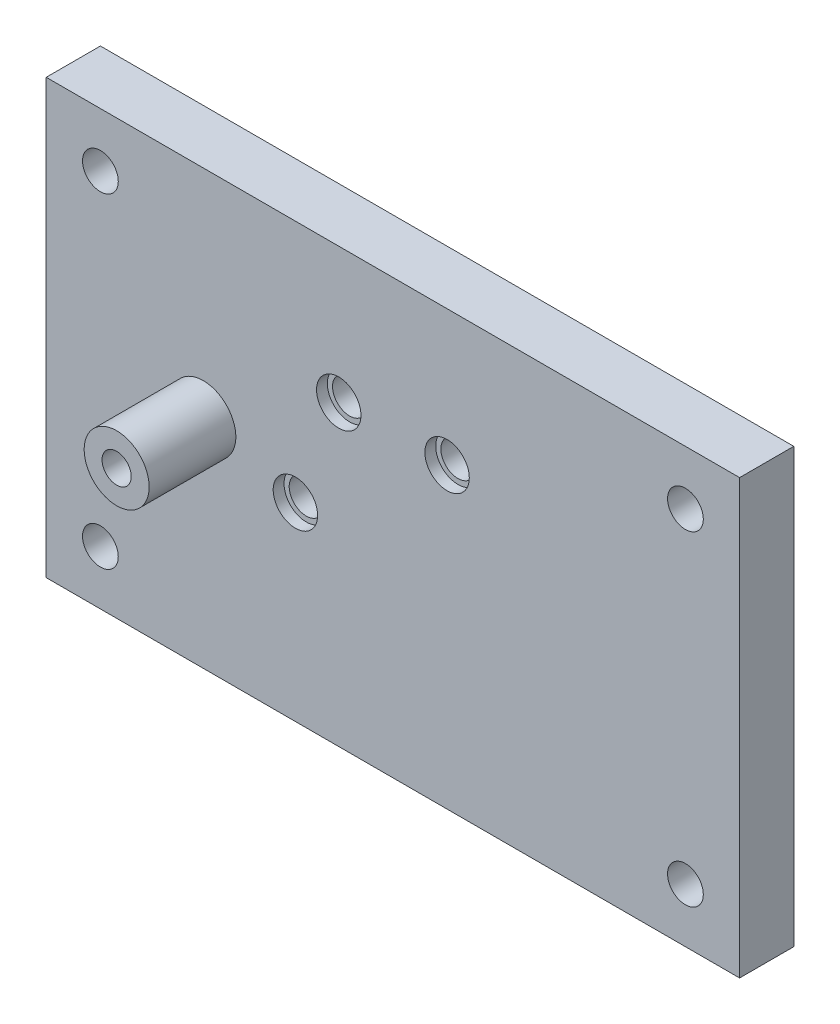
ISO-10303-21;
HEADER;
FILE_DESCRIPTION(('STEP AP214'),'2;1');
FILE_NAME('part.step','',(''),(''),'','','');
FILE_SCHEMA(('AUTOMOTIVE_DESIGN { 1 0 10303 214 1 1 1 1 }'));
ENDSEC;
DATA;
#1=APPLICATION_CONTEXT('core data for automotive mechanical design processes');
#2=APPLICATION_PROTOCOL_DEFINITION('international standard','automotive_design',2000,#1);
#3=PRODUCT_CONTEXT('',#1,'mechanical');
#4=PRODUCT('Part','Part','',(#3));
#5=PRODUCT_RELATED_PRODUCT_CATEGORY('part','',(#4));
#6=PRODUCT_DEFINITION_FORMATION('','',#4);
#7=PRODUCT_DEFINITION_CONTEXT('part definition',#1,'design');
#8=PRODUCT_DEFINITION('design','',#6,#7);
#9=PRODUCT_DEFINITION_SHAPE('','',#8);
#10=(LENGTH_UNIT() NAMED_UNIT(*) SI_UNIT(.MILLI.,.METRE.));
#11=(NAMED_UNIT(*) PLANE_ANGLE_UNIT() SI_UNIT($,.RADIAN.));
#12=(NAMED_UNIT(*) SI_UNIT($,.STERADIAN.) SOLID_ANGLE_UNIT());
#13=UNCERTAINTY_MEASURE_WITH_UNIT(LENGTH_MEASURE(1.E-05),#10,'distance_accuracy_value','');
#14=(GEOMETRIC_REPRESENTATION_CONTEXT(3) GLOBAL_UNCERTAINTY_ASSIGNED_CONTEXT((#13)) GLOBAL_UNIT_ASSIGNED_CONTEXT((#10,
#11,#12)) REPRESENTATION_CONTEXT('',''));
#15=CARTESIAN_POINT('',(0.,0.,0.));
#16=DIRECTION('',(0.,0.,1.));
#17=DIRECTION('',(1.,0.,0.));
#18=AXIS2_PLACEMENT_3D('',#15,#16,#17);
#19=CARTESIAN_POINT('',(-18.,-5.,10.));
#20=DIRECTION('',(0.,0.,-1.));
#21=DIRECTION('',(-1.,0.,0.));
#22=AXIS2_PLACEMENT_3D('',#19,#20,#21);
#23=CYLINDRICAL_SURFACE('',#22,3.15);
#24=CARTESIAN_POINT('',(-18.,-5.,0.));
#25=DIRECTION('',(0.,0.,1.));
#26=DIRECTION('',(1.,0.,0.));
#27=AXIS2_PLACEMENT_3D('',#24,#25,#26);
#28=CIRCLE('',#27,3.15);
#29=CARTESIAN_POINT('',(-14.85,-5.,0.));
#30=VERTEX_POINT('',#29);
#31=EDGE_CURVE('E120',#30,#30,#28,.T.);
#32=ORIENTED_EDGE('',*,*,#31,.F.);
#33=EDGE_LOOP('',(#32));
#34=FACE_BOUND('',#33,.T.);
#35=CARTESIAN_POINT('',(-18.,-5.,8.));
#36=DIRECTION('',(0.,0.,1.));
#37=DIRECTION('',(1.,0.,0.));
#38=AXIS2_PLACEMENT_3D('',#35,#36,#37);
#39=CIRCLE('',#38,3.15);
#40=CARTESIAN_POINT('',(-14.85,-5.,8.));
#41=VERTEX_POINT('',#40);
#42=EDGE_CURVE('E43',#41,#41,#39,.T.);
#43=ORIENTED_EDGE('',*,*,#42,.T.);
#44=EDGE_LOOP('',(#43));
#45=FACE_BOUND('',#44,.T.);
#46=ADVANCED_FACE('F39',(#34,#45),#23,.F.);
#47=CARTESIAN_POINT('',(10.,15.,10.));
#48=DIRECTION('',(0.,0.,-1.));
#49=DIRECTION('',(-1.,0.,0.));
#50=AXIS2_PLACEMENT_3D('',#47,#48,#49);
#51=CYLINDRICAL_SURFACE('',#50,3.15);
#52=CARTESIAN_POINT('',(10.,15.,0.));
#53=DIRECTION('',(0.,0.,1.));
#54=DIRECTION('',(1.,0.,0.));
#55=AXIS2_PLACEMENT_3D('',#52,#53,#54);
#56=CIRCLE('',#55,3.15);
#57=CARTESIAN_POINT('',(13.15,15.,0.));
#58=VERTEX_POINT('',#57);
#59=EDGE_CURVE('E145',#58,#58,#56,.T.);
#60=ORIENTED_EDGE('',*,*,#59,.F.);
#61=EDGE_LOOP('',(#60));
#62=FACE_BOUND('',#61,.T.);
#63=CARTESIAN_POINT('',(10.,15.,8.));
#64=DIRECTION('',(0.,0.,1.));
#65=DIRECTION('',(1.,0.,0.));
#66=AXIS2_PLACEMENT_3D('',#63,#64,#65);
#67=CIRCLE('',#66,3.15);
#68=CARTESIAN_POINT('',(13.15,15.,8.));
#69=VERTEX_POINT('',#68);
#70=EDGE_CURVE('E122',#69,#69,#67,.T.);
#71=ORIENTED_EDGE('',*,*,#70,.T.);
#72=EDGE_LOOP('',(#71));
#73=FACE_BOUND('',#72,.T.);
#74=ADVANCED_FACE('F184',(#62,#73),#51,.F.);
#75=CARTESIAN_POINT('',(-10.,15.,10.));
#76=DIRECTION('',(0.,0.,-1.));
#77=DIRECTION('',(-1.,0.,0.));
#78=AXIS2_PLACEMENT_3D('',#75,#76,#77);
#79=CYLINDRICAL_SURFACE('',#78,3.15);
#80=CARTESIAN_POINT('',(-10.,15.,0.));
#81=DIRECTION('',(0.,0.,1.));
#82=DIRECTION('',(1.,0.,0.));
#83=AXIS2_PLACEMENT_3D('',#80,#81,#82);
#84=CIRCLE('',#83,3.15);
#85=CARTESIAN_POINT('',(-6.85,15.,0.));
#86=VERTEX_POINT('',#85);
#87=EDGE_CURVE('E148',#86,#86,#84,.T.);
#88=ORIENTED_EDGE('',*,*,#87,.F.);
#89=EDGE_LOOP('',(#88));
#90=FACE_BOUND('',#89,.T.);
#91=CARTESIAN_POINT('',(-10.,15.,8.));
#92=DIRECTION('',(0.,0.,1.));
#93=DIRECTION('',(1.,0.,0.));
#94=AXIS2_PLACEMENT_3D('',#91,#92,#93);
#95=CIRCLE('',#94,3.15);
#96=CARTESIAN_POINT('',(-6.85,15.,8.));
#97=VERTEX_POINT('',#96);
#98=EDGE_CURVE('E118',#97,#97,#95,.T.);
#99=ORIENTED_EDGE('',*,*,#98,.T.);
#100=EDGE_LOOP('',(#99));
#101=FACE_BOUND('',#100,.T.);
#102=ADVANCED_FACE('F192',(#90,#101),#79,.F.);
#103=CARTESIAN_POINT('',(-64.,-40.,10.));
#104=DIRECTION('',(1.,0.,0.));
#105=DIRECTION('',(0.,0.,-1.));
#106=AXIS2_PLACEMENT_3D('',#103,#104,#105);
#107=PLANE('',#106);
#108=DIRECTION('',(0.,-1.,0.));
#109=VECTOR('',#108,1.);
#110=CARTESIAN_POINT('',(-64.,-40.,0.));
#111=LINE('',#110,#109);
#112=CARTESIAN_POINT('',(-64.,40.,0.));
#113=VERTEX_POINT('',#112);
#114=CARTESIAN_POINT('',(-64.,-40.,0.));
#115=VERTEX_POINT('',#114);
#116=EDGE_CURVE('E108',#113,#115,#111,.T.);
#117=ORIENTED_EDGE('',*,*,#116,.T.);
#118=DIRECTION('',(0.,0.,-1.));
#119=VECTOR('',#118,1.);
#120=CARTESIAN_POINT('',(-64.,-40.,10.));
#121=LINE('',#120,#119);
#122=CARTESIAN_POINT('',(-64.,-40.,10.));
#123=VERTEX_POINT('',#122);
#124=EDGE_CURVE('E49',#123,#115,#121,.T.);
#125=ORIENTED_EDGE('',*,*,#124,.F.);
#126=DIRECTION('',(0.,-1.,0.));
#127=VECTOR('',#126,1.);
#128=CARTESIAN_POINT('',(-64.,-40.,10.));
#129=LINE('',#128,#127);
#130=CARTESIAN_POINT('',(-64.,40.,10.));
#131=VERTEX_POINT('',#130);
#132=EDGE_CURVE('E94',#131,#123,#129,.T.);
#133=ORIENTED_EDGE('',*,*,#132,.F.);
#134=DIRECTION('',(0.,0.,-1.));
#135=VECTOR('',#134,1.);
#136=CARTESIAN_POINT('',(-64.,40.,10.));
#137=LINE('',#136,#135);
#138=EDGE_CURVE('E104',#131,#113,#137,.T.);
#139=ORIENTED_EDGE('',*,*,#138,.T.);
#140=EDGE_LOOP('',(#117,#125,#133,#139));
#141=FACE_BOUND('',#140,.T.);
#142=ADVANCED_FACE('F41',(#141),#107,.F.);
#143=CARTESIAN_POINT('',(-64.,-40.,10.));
#144=DIRECTION('',(0.,1.,0.));
#145=DIRECTION('',(0.,0.,1.));
#146=AXIS2_PLACEMENT_3D('',#143,#144,#145);
#147=PLANE('',#146);
#148=DIRECTION('',(1.,0.,0.));
#149=VECTOR('',#148,1.);
#150=CARTESIAN_POINT('',(-64.,-40.,0.));
#151=LINE('',#150,#149);
#152=CARTESIAN_POINT('',(64.,-40.,0.));
#153=VERTEX_POINT('',#152);
#154=EDGE_CURVE('E99',#115,#153,#151,.T.);
#155=ORIENTED_EDGE('',*,*,#154,.T.);
#156=DIRECTION('',(0.,0.,-1.));
#157=VECTOR('',#156,1.);
#158=CARTESIAN_POINT('',(64.,-40.,10.));
#159=LINE('',#158,#157);
#160=CARTESIAN_POINT('',(64.,-40.,10.));
#161=VERTEX_POINT('',#160);
#162=EDGE_CURVE('E97',#161,#153,#159,.T.);
#163=ORIENTED_EDGE('',*,*,#162,.F.);
#164=DIRECTION('',(1.,0.,0.));
#165=VECTOR('',#164,1.);
#166=CARTESIAN_POINT('',(-64.,-40.,10.));
#167=LINE('',#166,#165);
#168=EDGE_CURVE('E89',#123,#161,#167,.T.);
#169=ORIENTED_EDGE('',*,*,#168,.F.);
#170=ORIENTED_EDGE('',*,*,#124,.T.);
#171=EDGE_LOOP('',(#155,#163,#169,#170));
#172=FACE_BOUND('',#171,.T.);
#173=ADVANCED_FACE('F98',(#172),#147,.F.);
#174=CARTESIAN_POINT('',(64.,-40.,10.));
#175=DIRECTION('',(-1.,0.,0.));
#176=DIRECTION('',(0.,0.,1.));
#177=AXIS2_PLACEMENT_3D('',#174,#175,#176);
#178=PLANE('',#177);
#179=DIRECTION('',(0.,1.,0.));
#180=VECTOR('',#179,1.);
#181=CARTESIAN_POINT('',(64.,-40.,0.));
#182=LINE('',#181,#180);
#183=CARTESIAN_POINT('',(64.,40.,0.));
#184=VERTEX_POINT('',#183);
#185=EDGE_CURVE('E75',#153,#184,#182,.T.);
#186=ORIENTED_EDGE('',*,*,#185,.T.);
#187=DIRECTION('',(0.,0.,-1.));
#188=VECTOR('',#187,1.);
#189=CARTESIAN_POINT('',(64.,40.,10.));
#190=LINE('',#189,#188);
#191=CARTESIAN_POINT('',(64.,40.,10.));
#192=VERTEX_POINT('',#191);
#193=EDGE_CURVE('E100',#192,#184,#190,.T.);
#194=ORIENTED_EDGE('',*,*,#193,.F.);
#195=DIRECTION('',(0.,1.,0.));
#196=VECTOR('',#195,1.);
#197=CARTESIAN_POINT('',(64.,-40.,10.));
#198=LINE('',#197,#196);
#199=EDGE_CURVE('E92',#161,#192,#198,.T.);
#200=ORIENTED_EDGE('',*,*,#199,.F.);
#201=ORIENTED_EDGE('',*,*,#162,.T.);
#202=EDGE_LOOP('',(#186,#194,#200,#201));
#203=FACE_BOUND('',#202,.T.);
#204=ADVANCED_FACE('F102',(#203),#178,.F.);
#205=CARTESIAN_POINT('',(-64.,40.,10.));
#206=DIRECTION('',(0.,-1.,0.));
#207=DIRECTION('',(0.,0.,-1.));
#208=AXIS2_PLACEMENT_3D('',#205,#206,#207);
#209=PLANE('',#208);
#210=DIRECTION('',(-1.,0.,0.));
#211=VECTOR('',#210,1.);
#212=CARTESIAN_POINT('',(-64.,40.,0.));
#213=LINE('',#212,#211);
#214=EDGE_CURVE('E81',#184,#113,#213,.T.);
#215=ORIENTED_EDGE('',*,*,#214,.T.);
#216=ORIENTED_EDGE('',*,*,#138,.F.);
#217=DIRECTION('',(-1.,0.,0.));
#218=VECTOR('',#217,1.);
#219=CARTESIAN_POINT('',(-64.,40.,10.));
#220=LINE('',#219,#218);
#221=EDGE_CURVE('E58',#192,#131,#220,.T.);
#222=ORIENTED_EDGE('',*,*,#221,.F.);
#223=ORIENTED_EDGE('',*,*,#193,.T.);
#224=EDGE_LOOP('',(#215,#216,#222,#223));
#225=FACE_BOUND('',#224,.T.);
#226=ADVANCED_FACE('F170',(#225),#209,.F.);
#227=CARTESIAN_POINT('',(0.,0.,10.));
#228=DIRECTION('',(0.,0.,-1.));
#229=DIRECTION('',(-1.,0.,0.));
#230=AXIS2_PLACEMENT_3D('',#227,#228,#229);
#231=PLANE('',#230);
#232=CARTESIAN_POINT('',(54.,30.,10.));
#233=DIRECTION('',(0.,0.,1.));
#234=DIRECTION('',(1.,0.,0.));
#235=AXIS2_PLACEMENT_3D('',#232,#233,#234);
#236=CIRCLE('',#235,3.3);
#237=CARTESIAN_POINT('',(57.3,30.,10.));
#238=VERTEX_POINT('',#237);
#239=EDGE_CURVE('E367',#238,#238,#236,.T.);
#240=ORIENTED_EDGE('',*,*,#239,.F.);
#241=EDGE_LOOP('',(#240));
#242=FACE_BOUND('',#241,.T.);
#243=CARTESIAN_POINT('',(54.,-30.,10.));
#244=DIRECTION('',(0.,0.,1.));
#245=DIRECTION('',(1.,0.,0.));
#246=AXIS2_PLACEMENT_3D('',#243,#244,#245);
#247=CIRCLE('',#246,3.3);
#248=CARTESIAN_POINT('',(57.3,-30.,10.));
#249=VERTEX_POINT('',#248);
#250=EDGE_CURVE('E375',#249,#249,#247,.T.);
#251=ORIENTED_EDGE('',*,*,#250,.F.);
#252=EDGE_LOOP('',(#251));
#253=FACE_BOUND('',#252,.T.);
#254=CARTESIAN_POINT('',(-54.,30.,10.));
#255=DIRECTION('',(0.,0.,1.));
#256=DIRECTION('',(1.,0.,0.));
#257=AXIS2_PLACEMENT_3D('',#254,#255,#256);
#258=CIRCLE('',#257,3.3);
#259=CARTESIAN_POINT('',(-50.7,30.,10.));
#260=VERTEX_POINT('',#259);
#261=EDGE_CURVE('E381',#260,#260,#258,.T.);
#262=ORIENTED_EDGE('',*,*,#261,.F.);
#263=EDGE_LOOP('',(#262));
#264=FACE_BOUND('',#263,.T.);
#265=CARTESIAN_POINT('',(-54.,-30.,10.));
#266=DIRECTION('',(0.,0.,1.));
#267=DIRECTION('',(1.,0.,0.));
#268=AXIS2_PLACEMENT_3D('',#265,#266,#267);
#269=CIRCLE('',#268,3.3);
#270=CARTESIAN_POINT('',(-50.7,-30.,10.));
#271=VERTEX_POINT('',#270);
#272=EDGE_CURVE('E387',#271,#271,#269,.T.);
#273=ORIENTED_EDGE('',*,*,#272,.F.);
#274=EDGE_LOOP('',(#273));
#275=FACE_BOUND('',#274,.T.);
#276=CARTESIAN_POINT('',(-18.,-5.,10.));
#277=DIRECTION('',(0.,0.,1.));
#278=DIRECTION('',(1.,0.,0.));
#279=AXIS2_PLACEMENT_3D('',#276,#277,#278);
#280=CIRCLE('',#279,4.1);
#281=CARTESIAN_POINT('',(-13.9,-5.,10.));
#282=VERTEX_POINT('',#281);
#283=EDGE_CURVE('E391',#282,#282,#280,.T.);
#284=ORIENTED_EDGE('',*,*,#283,.F.);
#285=EDGE_LOOP('',(#284));
#286=FACE_BOUND('',#285,.T.);
#287=CARTESIAN_POINT('',(10.,15.,10.));
#288=DIRECTION('',(0.,0.,1.));
#289=DIRECTION('',(1.,0.,0.));
#290=AXIS2_PLACEMENT_3D('',#287,#288,#289);
#291=CIRCLE('',#290,4.1);
#292=CARTESIAN_POINT('',(14.1,15.,10.));
#293=VERTEX_POINT('',#292);
#294=EDGE_CURVE('E125',#293,#293,#291,.T.);
#295=ORIENTED_EDGE('',*,*,#294,.F.);
#296=EDGE_LOOP('',(#295));
#297=FACE_BOUND('',#296,.T.);
#298=CARTESIAN_POINT('',(-10.,15.,10.));
#299=DIRECTION('',(0.,0.,1.));
#300=DIRECTION('',(1.,0.,0.));
#301=AXIS2_PLACEMENT_3D('',#298,#299,#300);
#302=CIRCLE('',#301,4.1);
#303=CARTESIAN_POINT('',(-5.9,15.,10.));
#304=VERTEX_POINT('',#303);
#305=EDGE_CURVE('E121',#304,#304,#302,.T.);
#306=ORIENTED_EDGE('',*,*,#305,.F.);
#307=EDGE_LOOP('',(#306));
#308=FACE_BOUND('',#307,.T.);
#309=CARTESIAN_POINT('',(-35.,0.,10.));
#310=DIRECTION('',(0.,0.,-1.));
#311=DIRECTION('',(-1.,0.,0.));
#312=AXIS2_PLACEMENT_3D('',#309,#310,#311);
#313=CIRCLE('',#312,6.);
#314=CARTESIAN_POINT('',(-41.,0.,10.));
#315=VERTEX_POINT('',#314);
#316=EDGE_CURVE('E11',#315,#315,#313,.F.);
#317=ORIENTED_EDGE('',*,*,#316,.F.);
#318=EDGE_LOOP('',(#317));
#319=FACE_BOUND('',#318,.T.);
#320=ORIENTED_EDGE('',*,*,#132,.T.);
#321=ORIENTED_EDGE('',*,*,#168,.T.);
#322=ORIENTED_EDGE('',*,*,#199,.T.);
#323=ORIENTED_EDGE('',*,*,#221,.T.);
#324=EDGE_LOOP('',(#320,#321,#322,#323));
#325=FACE_BOUND('',#324,.T.);
#326=ADVANCED_FACE('F90',(#242,#253,#264,#275,#286,#297,#308,#319,#325),#231,.F.);
#327=CARTESIAN_POINT('',(0.,0.,0.));
#328=DIRECTION('',(0.,0.,-1.));
#329=DIRECTION('',(-1.,0.,0.));
#330=AXIS2_PLACEMENT_3D('',#327,#328,#329);
#331=PLANE('',#330);
#332=CARTESIAN_POINT('',(54.,30.,0.));
#333=DIRECTION('',(0.,0.,1.));
#334=DIRECTION('',(1.,0.,0.));
#335=AXIS2_PLACEMENT_3D('',#332,#333,#334);
#336=CIRCLE('',#335,3.3);
#337=CARTESIAN_POINT('',(57.3,30.,0.));
#338=VERTEX_POINT('',#337);
#339=EDGE_CURVE('E370',#338,#338,#336,.T.);
#340=ORIENTED_EDGE('',*,*,#339,.T.);
#341=EDGE_LOOP('',(#340));
#342=FACE_BOUND('',#341,.T.);
#343=CARTESIAN_POINT('',(54.,-30.,0.));
#344=DIRECTION('',(0.,0.,1.));
#345=DIRECTION('',(1.,0.,0.));
#346=AXIS2_PLACEMENT_3D('',#343,#344,#345);
#347=CIRCLE('',#346,3.3);
#348=CARTESIAN_POINT('',(57.3,-30.,0.));
#349=VERTEX_POINT('',#348);
#350=EDGE_CURVE('E372',#349,#349,#347,.T.);
#351=ORIENTED_EDGE('',*,*,#350,.T.);
#352=EDGE_LOOP('',(#351));
#353=FACE_BOUND('',#352,.T.);
#354=CARTESIAN_POINT('',(-54.,30.,0.));
#355=DIRECTION('',(0.,0.,1.));
#356=DIRECTION('',(1.,0.,0.));
#357=AXIS2_PLACEMENT_3D('',#354,#355,#356);
#358=CIRCLE('',#357,3.3);
#359=CARTESIAN_POINT('',(-50.7,30.,0.));
#360=VERTEX_POINT('',#359);
#361=EDGE_CURVE('E378',#360,#360,#358,.T.);
#362=ORIENTED_EDGE('',*,*,#361,.T.);
#363=EDGE_LOOP('',(#362));
#364=FACE_BOUND('',#363,.T.);
#365=CARTESIAN_POINT('',(-54.,-30.,0.));
#366=DIRECTION('',(0.,0.,1.));
#367=DIRECTION('',(1.,0.,0.));
#368=AXIS2_PLACEMENT_3D('',#365,#366,#367);
#369=CIRCLE('',#368,3.3);
#370=CARTESIAN_POINT('',(-50.7,-30.,0.));
#371=VERTEX_POINT('',#370);
#372=EDGE_CURVE('E384',#371,#371,#369,.T.);
#373=ORIENTED_EDGE('',*,*,#372,.T.);
#374=EDGE_LOOP('',(#373));
#375=FACE_BOUND('',#374,.T.);
#376=ORIENTED_EDGE('',*,*,#31,.T.);
#377=EDGE_LOOP('',(#376));
#378=FACE_BOUND('',#377,.T.);
#379=ORIENTED_EDGE('',*,*,#59,.T.);
#380=EDGE_LOOP('',(#379));
#381=FACE_BOUND('',#380,.T.);
#382=ORIENTED_EDGE('',*,*,#87,.T.);
#383=EDGE_LOOP('',(#382));
#384=FACE_BOUND('',#383,.T.);
#385=CARTESIAN_POINT('',(-35.,0.,0.));
#386=DIRECTION('',(0.,0.,1.));
#387=DIRECTION('',(1.,0.,0.));
#388=AXIS2_PLACEMENT_3D('',#385,#386,#387);
#389=CIRCLE('',#388,2.7);
#390=CARTESIAN_POINT('',(-37.7,0.,0.));
#391=VERTEX_POINT('',#390);
#392=EDGE_CURVE('E151',#391,#391,#389,.T.);
#393=ORIENTED_EDGE('',*,*,#392,.T.);
#394=EDGE_LOOP('',(#393));
#395=FACE_BOUND('',#394,.T.);
#396=ORIENTED_EDGE('',*,*,#116,.F.);
#397=ORIENTED_EDGE('',*,*,#214,.F.);
#398=ORIENTED_EDGE('',*,*,#185,.F.);
#399=ORIENTED_EDGE('',*,*,#154,.F.);
#400=EDGE_LOOP('',(#396,#397,#398,#399));
#401=FACE_BOUND('',#400,.T.);
#402=ADVANCED_FACE('F165',(#342,#353,#364,#375,#378,#381,#384,#395,#401),#331,.T.);
#403=CARTESIAN_POINT('',(-35.,0.,26.));
#404=DIRECTION('',(0.,0.,-1.));
#405=DIRECTION('',(-1.,0.,0.));
#406=AXIS2_PLACEMENT_3D('',#403,#404,#405);
#407=CYLINDRICAL_SURFACE('',#406,6.);
#408=CARTESIAN_POINT('',(-35.,0.,26.));
#409=DIRECTION('',(0.,0.,1.));
#410=DIRECTION('',(1.,0.,0.));
#411=AXIS2_PLACEMENT_3D('',#408,#409,#410);
#412=CIRCLE('',#411,6.);
#413=CARTESIAN_POINT('',(-29.,0.,26.));
#414=VERTEX_POINT('',#413);
#415=EDGE_CURVE('E111',#414,#414,#412,.T.);
#416=ORIENTED_EDGE('',*,*,#415,.F.);
#417=EDGE_LOOP('',(#416));
#418=FACE_BOUND('',#417,.T.);
#419=ORIENTED_EDGE('',*,*,#316,.T.);
#420=EDGE_LOOP('',(#419));
#421=FACE_BOUND('',#420,.T.);
#422=ADVANCED_FACE('F162',(#418,#421),#407,.T.);
#423=CARTESIAN_POINT('',(-35.,0.,26.));
#424=DIRECTION('',(0.,0.,1.));
#425=DIRECTION('',(1.,0.,0.));
#426=AXIS2_PLACEMENT_3D('',#423,#424,#425);
#427=PLANE('',#426);
#428=CARTESIAN_POINT('',(-35.,0.,26.));
#429=DIRECTION('',(0.,0.,1.));
#430=DIRECTION('',(1.,0.,0.));
#431=AXIS2_PLACEMENT_3D('',#428,#429,#430);
#432=CIRCLE('',#431,2.7);
#433=CARTESIAN_POINT('',(-37.7,0.,26.));
#434=VERTEX_POINT('',#433);
#435=EDGE_CURVE('E152',#434,#434,#432,.T.);
#436=ORIENTED_EDGE('',*,*,#435,.F.);
#437=EDGE_LOOP('',(#436));
#438=FACE_BOUND('',#437,.T.);
#439=ORIENTED_EDGE('',*,*,#415,.T.);
#440=EDGE_LOOP('',(#439));
#441=FACE_BOUND('',#440,.T.);
#442=ADVANCED_FACE('F160',(#438,#441),#427,.T.);
#443=CARTESIAN_POINT('',(-35.,0.,26.));
#444=DIRECTION('',(0.,0.,-1.));
#445=DIRECTION('',(-1.,0.,0.));
#446=AXIS2_PLACEMENT_3D('',#443,#444,#445);
#447=CYLINDRICAL_SURFACE('',#446,2.7);
#448=CARTESIAN_POINT('',(-37.7,0.,26.));
#449=CARTESIAN_POINT('',(-37.7,0.,25.7291666666667));
#450=CARTESIAN_POINT('',(-37.7,0.,25.4583333333333));
#451=CARTESIAN_POINT('',(-37.7,0.,24.9166666666667));
#452=CARTESIAN_POINT('',(-37.7,0.,24.6458333333333));
#453=CARTESIAN_POINT('',(-37.7,0.,24.1041666666667));
#454=CARTESIAN_POINT('',(-37.7,0.,23.8333333333333));
#455=CARTESIAN_POINT('',(-37.7,0.,23.2916666666667));
#456=CARTESIAN_POINT('',(-37.7,0.,23.0208333333333));
#457=CARTESIAN_POINT('',(-37.7,0.,22.4791666666667));
#458=CARTESIAN_POINT('',(-37.7,0.,22.2083333333333));
#459=CARTESIAN_POINT('',(-37.7,0.,21.6666666666667));
#460=CARTESIAN_POINT('',(-37.7,0.,21.3958333333333));
#461=CARTESIAN_POINT('',(-37.7,0.,20.8541666666667));
#462=CARTESIAN_POINT('',(-37.7,0.,20.5833333333333));
#463=CARTESIAN_POINT('',(-37.7,0.,20.0416666666667));
#464=CARTESIAN_POINT('',(-37.7,0.,19.7708333333333));
#465=CARTESIAN_POINT('',(-37.7,0.,19.2291666666667));
#466=CARTESIAN_POINT('',(-37.7,0.,18.9583333333333));
#467=CARTESIAN_POINT('',(-37.7,0.,18.4166666666667));
#468=CARTESIAN_POINT('',(-37.7,0.,18.1458333333333));
#469=CARTESIAN_POINT('',(-37.7,0.,17.6041666666667));
#470=CARTESIAN_POINT('',(-37.7,0.,17.3333333333333));
#471=CARTESIAN_POINT('',(-37.7,0.,16.7916666666667));
#472=CARTESIAN_POINT('',(-37.7,0.,16.5208333333333));
#473=CARTESIAN_POINT('',(-37.7,0.,15.9791666666667));
#474=CARTESIAN_POINT('',(-37.7,0.,15.7083333333333));
#475=CARTESIAN_POINT('',(-37.7,0.,15.1666666666667));
#476=CARTESIAN_POINT('',(-37.7,0.,14.8958333333333));
#477=CARTESIAN_POINT('',(-37.7,0.,14.3541666666667));
#478=CARTESIAN_POINT('',(-37.7,0.,14.0833333333333));
#479=CARTESIAN_POINT('',(-37.7,0.,13.5416666666667));
#480=CARTESIAN_POINT('',(-37.7,0.,13.2708333333333));
#481=CARTESIAN_POINT('',(-37.7,0.,12.7291666666667));
#482=CARTESIAN_POINT('',(-37.7,0.,12.4583333333333));
#483=CARTESIAN_POINT('',(-37.7,0.,11.9166666666667));
#484=CARTESIAN_POINT('',(-37.7,0.,11.6458333333333));
#485=CARTESIAN_POINT('',(-37.7,0.,11.1041666666667));
#486=CARTESIAN_POINT('',(-37.7,0.,10.8333333333333));
#487=CARTESIAN_POINT('',(-37.7,0.,10.2916666666667));
#488=CARTESIAN_POINT('',(-37.7,0.,10.0208333333333));
#489=CARTESIAN_POINT('',(-37.7,0.,9.47916666666667));
#490=CARTESIAN_POINT('',(-37.7,0.,9.20833333333333));
#491=CARTESIAN_POINT('',(-37.7,0.,8.66666666666667));
#492=CARTESIAN_POINT('',(-37.7,0.,8.39583333333333));
#493=CARTESIAN_POINT('',(-37.7,0.,7.85416666666667));
#494=CARTESIAN_POINT('',(-37.7,0.,7.58333333333333));
#495=CARTESIAN_POINT('',(-37.7,0.,7.04166666666667));
#496=CARTESIAN_POINT('',(-37.7,0.,6.77083333333333));
#497=CARTESIAN_POINT('',(-37.7,0.,6.22916666666667));
#498=CARTESIAN_POINT('',(-37.7,0.,5.95833333333333));
#499=CARTESIAN_POINT('',(-37.7,0.,5.41666666666667));
#500=CARTESIAN_POINT('',(-37.7,0.,5.14583333333333));
#501=CARTESIAN_POINT('',(-37.7,0.,4.60416666666667));
#502=CARTESIAN_POINT('',(-37.7,0.,4.33333333333333));
#503=CARTESIAN_POINT('',(-37.7,0.,3.79166666666667));
#504=CARTESIAN_POINT('',(-37.7,0.,3.52083333333333));
#505=CARTESIAN_POINT('',(-37.7,0.,2.97916666666667));
#506=CARTESIAN_POINT('',(-37.7,0.,2.70833333333333));
#507=CARTESIAN_POINT('',(-37.7,0.,2.16666666666667));
#508=CARTESIAN_POINT('',(-37.7,0.,1.89583333333333));
#509=CARTESIAN_POINT('',(-37.7,0.,1.35416666666667));
#510=CARTESIAN_POINT('',(-37.7,0.,1.08333333333333));
#511=CARTESIAN_POINT('',(-37.7,0.,0.541666666666667));
#512=CARTESIAN_POINT('',(-37.7,0.,0.270833333333334));
#513=CARTESIAN_POINT('',(-37.7,0.,0.));
#514=B_SPLINE_CURVE_WITH_KNOTS('',3,(#448,#449,#450,#451,#452,#453,#454,#455,#456,#457,#458,
#459,#460,#461,#462,#463,#464,#465,#466,#467,#468,#469,#470,#471,#472,#473,#474,#475,#476,#477,
#478,#479,#480,#481,#482,#483,#484,#485,#486,#487,#488,#489,#490,#491,#492,#493,#494,#495,#496,
#497,#498,#499,#500,#501,#502,#503,#504,#505,#506,#507,#508,#509,#510,#511,#512,#513),
.UNSPECIFIED.,.F.,.F.,(4,2,2,2,2,2,2,2,2,2,2,2,2,2,2,2,2,2,2,2,2,2,2,2,2,2,2,2,2,2,2,2,4),(0.,
0.812500000000001,1.625,2.4375,3.25,4.0625,4.875,5.6875,6.5,7.3125,8.125,8.9375,9.75,10.5625,
11.375,12.1875,13.,13.8125,14.625,15.4375,16.25,17.0625,17.875,18.6875,19.5,20.3125,21.125,
21.9375,22.75,23.5625,24.375,25.1875,26.),.UNSPECIFIED.);
#515=EDGE_CURVE('BSEAM204',#434,#391,#514,.T.);
#516=ORIENTED_EDGE('',*,*,#435,.T.);
#517=ORIENTED_EDGE('',*,*,#392,.F.);
#518=ORIENTED_EDGE('',*,*,#515,.T.);
#519=ORIENTED_EDGE('',*,*,#515,.F.);
#520=EDGE_LOOP('',(#516,#518,#517,#519));
#521=FACE_BOUND('',#520,.T.);
#522=ADVANCED_FACE('F204',(#521),#447,.F.);
#523=CARTESIAN_POINT('',(-10.,15.,10.));
#524=DIRECTION('',(0.,0.,-1.));
#525=DIRECTION('',(-1.,0.,0.));
#526=AXIS2_PLACEMENT_3D('',#523,#524,#525);
#527=CYLINDRICAL_SURFACE('',#526,4.1);
#528=ORIENTED_EDGE('',*,*,#305,.T.);
#529=EDGE_LOOP('',(#528));
#530=FACE_BOUND('',#529,.T.);
#531=CARTESIAN_POINT('',(-10.,15.,8.));
#532=DIRECTION('',(0.,0.,1.));
#533=DIRECTION('',(1.,0.,0.));
#534=AXIS2_PLACEMENT_3D('',#531,#532,#533);
#535=CIRCLE('',#534,4.1);
#536=CARTESIAN_POINT('',(-5.9,15.,8.));
#537=VERTEX_POINT('',#536);
#538=EDGE_CURVE('E124',#537,#537,#535,.T.);
#539=ORIENTED_EDGE('',*,*,#538,.F.);
#540=EDGE_LOOP('',(#539));
#541=FACE_BOUND('',#540,.T.);
#542=ADVANCED_FACE('F198',(#530,#541),#527,.F.);
#543=CARTESIAN_POINT('',(-10.,15.,8.));
#544=DIRECTION('',(0.,0.,1.));
#545=DIRECTION('',(1.,0.,0.));
#546=AXIS2_PLACEMENT_3D('',#543,#544,#545);
#547=PLANE('',#546);
#548=ORIENTED_EDGE('',*,*,#98,.F.);
#549=EDGE_LOOP('',(#548));
#550=FACE_BOUND('',#549,.T.);
#551=ORIENTED_EDGE('',*,*,#538,.T.);
#552=EDGE_LOOP('',(#551));
#553=FACE_BOUND('',#552,.T.);
#554=ADVANCED_FACE('F268',(#550,#553),#547,.T.);
#555=CARTESIAN_POINT('',(10.,15.,10.));
#556=DIRECTION('',(0.,0.,-1.));
#557=DIRECTION('',(-1.,0.,0.));
#558=AXIS2_PLACEMENT_3D('',#555,#556,#557);
#559=CYLINDRICAL_SURFACE('',#558,4.1);
#560=ORIENTED_EDGE('',*,*,#294,.T.);
#561=EDGE_LOOP('',(#560));
#562=FACE_BOUND('',#561,.T.);
#563=CARTESIAN_POINT('',(10.,15.,8.));
#564=DIRECTION('',(0.,0.,1.));
#565=DIRECTION('',(1.,0.,0.));
#566=AXIS2_PLACEMENT_3D('',#563,#564,#565);
#567=CIRCLE('',#566,4.1);
#568=CARTESIAN_POINT('',(14.1,15.,8.));
#569=VERTEX_POINT('',#568);
#570=EDGE_CURVE('E131',#569,#569,#567,.T.);
#571=ORIENTED_EDGE('',*,*,#570,.F.);
#572=EDGE_LOOP('',(#571));
#573=FACE_BOUND('',#572,.T.);
#574=ADVANCED_FACE('F277',(#562,#573),#559,.F.);
#575=CARTESIAN_POINT('',(10.,15.,8.));
#576=DIRECTION('',(0.,0.,1.));
#577=DIRECTION('',(1.,0.,0.));
#578=AXIS2_PLACEMENT_3D('',#575,#576,#577);
#579=PLANE('',#578);
#580=ORIENTED_EDGE('',*,*,#70,.F.);
#581=EDGE_LOOP('',(#580));
#582=FACE_BOUND('',#581,.T.);
#583=ORIENTED_EDGE('',*,*,#570,.T.);
#584=EDGE_LOOP('',(#583));
#585=FACE_BOUND('',#584,.T.);
#586=ADVANCED_FACE('F291',(#582,#585),#579,.T.);
#587=CARTESIAN_POINT('',(-18.,-5.,10.));
#588=DIRECTION('',(0.,0.,-1.));
#589=DIRECTION('',(-1.,0.,0.));
#590=AXIS2_PLACEMENT_3D('',#587,#588,#589);
#591=CYLINDRICAL_SURFACE('',#590,4.1);
#592=ORIENTED_EDGE('',*,*,#283,.T.);
#593=EDGE_LOOP('',(#592));
#594=FACE_BOUND('',#593,.T.);
#595=CARTESIAN_POINT('',(-18.,-5.,8.));
#596=DIRECTION('',(0.,0.,1.));
#597=DIRECTION('',(1.,0.,0.));
#598=AXIS2_PLACEMENT_3D('',#595,#596,#597);
#599=CIRCLE('',#598,4.1);
#600=CARTESIAN_POINT('',(-13.9,-5.,8.));
#601=VERTEX_POINT('',#600);
#602=EDGE_CURVE('E138',#601,#601,#599,.T.);
#603=ORIENTED_EDGE('',*,*,#602,.F.);
#604=EDGE_LOOP('',(#603));
#605=FACE_BOUND('',#604,.T.);
#606=ADVANCED_FACE('F299',(#594,#605),#591,.F.);
#607=CARTESIAN_POINT('',(-18.,-5.,8.));
#608=DIRECTION('',(0.,0.,1.));
#609=DIRECTION('',(1.,0.,0.));
#610=AXIS2_PLACEMENT_3D('',#607,#608,#609);
#611=PLANE('',#610);
#612=ORIENTED_EDGE('',*,*,#42,.F.);
#613=EDGE_LOOP('',(#612));
#614=FACE_BOUND('',#613,.T.);
#615=ORIENTED_EDGE('',*,*,#602,.T.);
#616=EDGE_LOOP('',(#615));
#617=FACE_BOUND('',#616,.T.);
#618=ADVANCED_FACE('F312',(#614,#617),#611,.T.);
#619=CARTESIAN_POINT('',(-54.,-30.,10.));
#620=DIRECTION('',(0.,0.,-1.));
#621=DIRECTION('',(-1.,0.,0.));
#622=AXIS2_PLACEMENT_3D('',#619,#620,#621);
#623=CYLINDRICAL_SURFACE('',#622,3.3);
#624=ORIENTED_EDGE('',*,*,#272,.T.);
#625=EDGE_LOOP('',(#624));
#626=FACE_BOUND('',#625,.T.);
#627=ORIENTED_EDGE('',*,*,#372,.F.);
#628=EDGE_LOOP('',(#627));
#629=FACE_BOUND('',#628,.T.);
#630=ADVANCED_FACE('F322',(#626,#629),#623,.F.);
#631=CARTESIAN_POINT('',(-54.,30.,10.));
#632=DIRECTION('',(0.,0.,-1.));
#633=DIRECTION('',(-1.,0.,0.));
#634=AXIS2_PLACEMENT_3D('',#631,#632,#633);
#635=CYLINDRICAL_SURFACE('',#634,3.3);
#636=ORIENTED_EDGE('',*,*,#261,.T.);
#637=EDGE_LOOP('',(#636));
#638=FACE_BOUND('',#637,.T.);
#639=ORIENTED_EDGE('',*,*,#361,.F.);
#640=EDGE_LOOP('',(#639));
#641=FACE_BOUND('',#640,.T.);
#642=ADVANCED_FACE('F332',(#638,#641),#635,.F.);
#643=CARTESIAN_POINT('',(54.,-30.,10.));
#644=DIRECTION('',(0.,0.,-1.));
#645=DIRECTION('',(-1.,0.,0.));
#646=AXIS2_PLACEMENT_3D('',#643,#644,#645);
#647=CYLINDRICAL_SURFACE('',#646,3.3);
#648=ORIENTED_EDGE('',*,*,#250,.T.);
#649=EDGE_LOOP('',(#648));
#650=FACE_BOUND('',#649,.T.);
#651=ORIENTED_EDGE('',*,*,#350,.F.);
#652=EDGE_LOOP('',(#651));
#653=FACE_BOUND('',#652,.T.);
#654=ADVANCED_FACE('F342',(#650,#653),#647,.F.);
#655=CARTESIAN_POINT('',(54.,30.,10.));
#656=DIRECTION('',(0.,0.,-1.));
#657=DIRECTION('',(-1.,0.,0.));
#658=AXIS2_PLACEMENT_3D('',#655,#656,#657);
#659=CYLINDRICAL_SURFACE('',#658,3.3);
#660=ORIENTED_EDGE('',*,*,#239,.T.);
#661=EDGE_LOOP('',(#660));
#662=FACE_BOUND('',#661,.T.);
#663=ORIENTED_EDGE('',*,*,#339,.F.);
#664=EDGE_LOOP('',(#663));
#665=FACE_BOUND('',#664,.T.);
#666=ADVANCED_FACE('F351',(#662,#665),#659,.F.);
#667=CLOSED_SHELL('',(#46,#74,#102,#142,#173,#204,#226,#326,#402,#422,#442,#522,#542,#554,#574,
#586,#606,#618,#630,#642,#654,#666));
#668=MANIFOLD_SOLID_BREP('B2',#667);
#669=ADVANCED_BREP_SHAPE_REPRESENTATION('',(#18,#668),#14);
#670=SHAPE_DEFINITION_REPRESENTATION(#9,#669);
ENDSEC;
END-ISO-10303-21;
